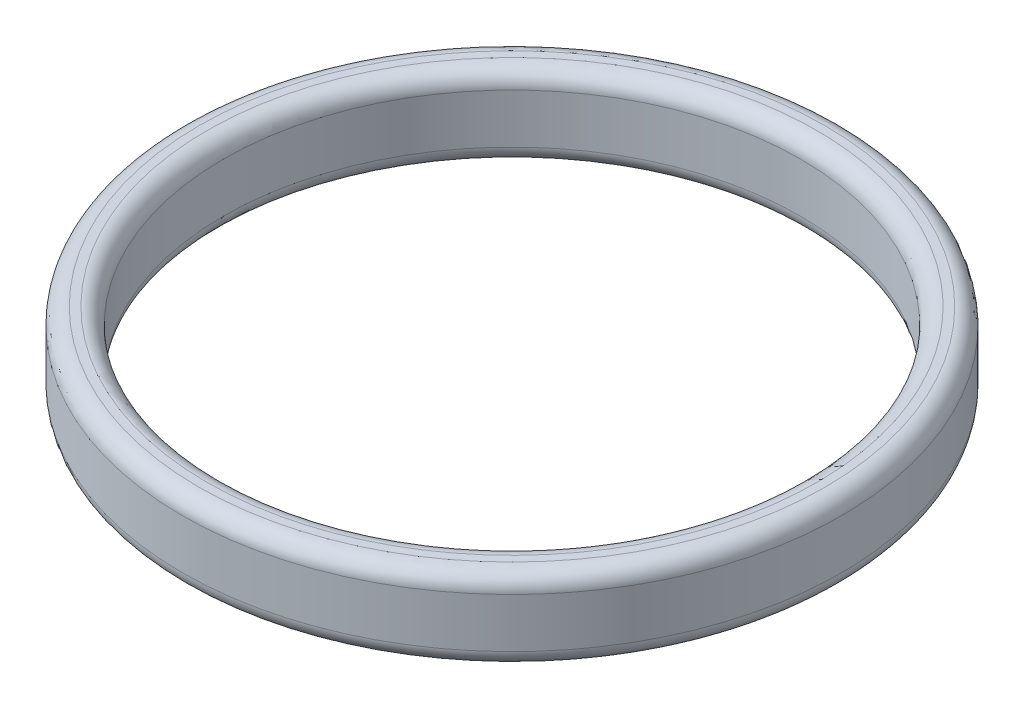
ISO-10303-21;
HEADER;
FILE_DESCRIPTION(('STEP AP214'),'2;1');
FILE_NAME('part.step','',(''),(''),'','','');
FILE_SCHEMA(('AUTOMOTIVE_DESIGN { 1 0 10303 214 1 1 1 1 }'));
ENDSEC;
DATA;
#1=APPLICATION_CONTEXT('core data for automotive mechanical design processes');
#2=APPLICATION_PROTOCOL_DEFINITION('international standard','automotive_design',2000,#1);
#3=PRODUCT_CONTEXT('',#1,'mechanical');
#4=PRODUCT('Part','Part','',(#3));
#5=PRODUCT_RELATED_PRODUCT_CATEGORY('part','',(#4));
#6=PRODUCT_DEFINITION_FORMATION('','',#4);
#7=PRODUCT_DEFINITION_CONTEXT('part definition',#1,'design');
#8=PRODUCT_DEFINITION('design','',#6,#7);
#9=PRODUCT_DEFINITION_SHAPE('','',#8);
#10=(LENGTH_UNIT() NAMED_UNIT(*) SI_UNIT(.MILLI.,.METRE.));
#11=(NAMED_UNIT(*) PLANE_ANGLE_UNIT() SI_UNIT($,.RADIAN.));
#12=(NAMED_UNIT(*) SI_UNIT($,.STERADIAN.) SOLID_ANGLE_UNIT());
#13=UNCERTAINTY_MEASURE_WITH_UNIT(LENGTH_MEASURE(1.E-05),#10,'distance_accuracy_value','');
#14=(GEOMETRIC_REPRESENTATION_CONTEXT(3) GLOBAL_UNCERTAINTY_ASSIGNED_CONTEXT((#13)) GLOBAL_UNIT_ASSIGNED_CONTEXT((#10,
#11,#12)) REPRESENTATION_CONTEXT('',''));
#15=CARTESIAN_POINT('',(0.,0.,0.));
#16=DIRECTION('',(0.,0.,1.));
#17=DIRECTION('',(1.,0.,0.));
#18=AXIS2_PLACEMENT_3D('',#15,#16,#17);
#19=CARTESIAN_POINT('',(0.,0.,0.));
#20=DIRECTION('',(0.,1.,0.));
#21=DIRECTION('',(1.,0.,0.));
#22=AXIS2_PLACEMENT_3D('',#19,#20,#21);
#23=PLANE('',#22);
#24=CARTESIAN_POINT('',(0.,0.,0.));
#25=DIRECTION('',(0.,1.,0.));
#26=DIRECTION('',(0.,0.,1.));
#27=AXIS2_PLACEMENT_3D('',#24,#25,#26);
#28=CIRCLE('',#27,5.0875);
#29=CARTESIAN_POINT('',(0.,0.,5.0875));
#30=VERTEX_POINT('',#29);
#31=EDGE_CURVE('E44',#30,#30,#28,.T.);
#32=ORIENTED_EDGE('',*,*,#31,.T.);
#33=EDGE_LOOP('',(#32));
#34=FACE_BOUND('',#33,.T.);
#35=CARTESIAN_POINT('',(0.,0.,0.));
#36=DIRECTION('',(0.,-1.,0.));
#37=DIRECTION('',(0.,0.,1.));
#38=AXIS2_PLACEMENT_3D('',#35,#36,#37);
#39=CIRCLE('',#38,5.225);
#40=CARTESIAN_POINT('',(0.,0.,5.225));
#41=VERTEX_POINT('',#40);
#42=EDGE_CURVE('E53',#41,#41,#39,.T.);
#43=ORIENTED_EDGE('',*,*,#42,.T.);
#44=EDGE_LOOP('',(#43));
#45=FACE_BOUND('',#44,.T.);
#46=ADVANCED_FACE('F15',(#34,#45),#23,.F.);
#47=CARTESIAN_POINT('',(0.,1.375,0.));
#48=DIRECTION('',(0.,1.,0.));
#49=DIRECTION('',(1.,0.,0.));
#50=AXIS2_PLACEMENT_3D('',#47,#48,#49);
#51=PLANE('',#50);
#52=CARTESIAN_POINT('',(0.,1.375,0.));
#53=DIRECTION('',(0.,-1.,0.));
#54=DIRECTION('',(0.,0.,1.));
#55=AXIS2_PLACEMENT_3D('',#52,#53,#54);
#56=CIRCLE('',#55,5.0875);
#57=CARTESIAN_POINT('',(0.,1.375,5.0875));
#58=VERTEX_POINT('',#57);
#59=EDGE_CURVE('E22',#58,#58,#56,.T.);
#60=ORIENTED_EDGE('',*,*,#59,.T.);
#61=EDGE_LOOP('',(#60));
#62=FACE_BOUND('',#61,.T.);
#63=CARTESIAN_POINT('',(0.,1.375,0.));
#64=DIRECTION('',(0.,1.,0.));
#65=DIRECTION('',(0.,0.,1.));
#66=AXIS2_PLACEMENT_3D('',#63,#64,#65);
#67=CIRCLE('',#66,5.225);
#68=CARTESIAN_POINT('',(0.,1.375,5.225));
#69=VERTEX_POINT('',#68);
#70=EDGE_CURVE('E31',#69,#69,#67,.T.);
#71=ORIENTED_EDGE('',*,*,#70,.T.);
#72=EDGE_LOOP('',(#71));
#73=FACE_BOUND('',#72,.T.);
#74=ADVANCED_FACE('F85',(#62,#73),#51,.T.);
#75=CARTESIAN_POINT('',(0.,1.375,0.));
#76=DIRECTION('',(0.,-1.,0.));
#77=DIRECTION('',(0.,0.,-1.));
#78=AXIS2_PLACEMENT_3D('',#75,#76,#77);
#79=CYLINDRICAL_SURFACE('',#78,5.5);
#80=CARTESIAN_POINT('',(0.,0.275,0.));
#81=DIRECTION('',(0.,1.,0.));
#82=DIRECTION('',(0.,0.,1.));
#83=AXIS2_PLACEMENT_3D('',#80,#81,#82);
#84=CIRCLE('',#83,5.5);
#85=CARTESIAN_POINT('',(0.,0.275,5.5));
#86=VERTEX_POINT('',#85);
#87=EDGE_CURVE('E48',#86,#86,#84,.T.);
#88=ORIENTED_EDGE('',*,*,#87,.T.);
#89=EDGE_LOOP('',(#88));
#90=FACE_BOUND('',#89,.T.);
#91=CARTESIAN_POINT('',(0.,1.1,0.));
#92=DIRECTION('',(0.,-1.,0.));
#93=DIRECTION('',(0.,0.,1.));
#94=AXIS2_PLACEMENT_3D('',#91,#92,#93);
#95=CIRCLE('',#94,5.5);
#96=CARTESIAN_POINT('',(0.,1.1,5.5));
#97=VERTEX_POINT('',#96);
#98=EDGE_CURVE('E38',#97,#97,#95,.T.);
#99=ORIENTED_EDGE('',*,*,#98,.T.);
#100=EDGE_LOOP('',(#99));
#101=FACE_BOUND('',#100,.T.);
#102=ADVANCED_FACE('F76',(#90,#101),#79,.T.);
#103=CARTESIAN_POINT('',(0.,1.375,0.));
#104=DIRECTION('',(0.,-1.,0.));
#105=DIRECTION('',(0.,0.,-1.));
#106=AXIS2_PLACEMENT_3D('',#103,#104,#105);
#107=CYLINDRICAL_SURFACE('',#106,4.8125);
#108=CARTESIAN_POINT('',(0.,0.275,0.));
#109=DIRECTION('',(0.,-1.,0.));
#110=DIRECTION('',(0.,0.,1.));
#111=AXIS2_PLACEMENT_3D('',#108,#109,#110);
#112=CIRCLE('',#111,4.8125);
#113=CARTESIAN_POINT('',(0.,0.275,4.8125));
#114=VERTEX_POINT('',#113);
#115=EDGE_CURVE('E45',#114,#114,#112,.T.);
#116=ORIENTED_EDGE('',*,*,#115,.T.);
#117=EDGE_LOOP('',(#116));
#118=FACE_BOUND('',#117,.T.);
#119=CARTESIAN_POINT('',(0.,1.1,0.));
#120=DIRECTION('',(0.,1.,0.));
#121=DIRECTION('',(0.,0.,1.));
#122=AXIS2_PLACEMENT_3D('',#119,#120,#121);
#123=CIRCLE('',#122,4.8125);
#124=CARTESIAN_POINT('',(0.,1.1,4.8125));
#125=VERTEX_POINT('',#124);
#126=EDGE_CURVE('E10',#125,#125,#123,.T.);
#127=ORIENTED_EDGE('',*,*,#126,.T.);
#128=EDGE_LOOP('',(#127));
#129=FACE_BOUND('',#128,.T.);
#130=ADVANCED_FACE('F73',(#118,#129),#107,.F.);
#131=CARTESIAN_POINT('',(0.,1.1,0.));
#132=DIRECTION('',(0.,1.,0.));
#133=DIRECTION('',(0.,0.,1.));
#134=AXIS2_PLACEMENT_3D('',#131,#132,#133);
#135=TOROIDAL_SURFACE('',#134,5.0875,0.275);
#136=ORIENTED_EDGE('',*,*,#126,.F.);
#137=EDGE_LOOP('',(#136));
#138=FACE_BOUND('',#137,.T.);
#139=ORIENTED_EDGE('',*,*,#59,.F.);
#140=EDGE_LOOP('',(#139));
#141=FACE_BOUND('',#140,.T.);
#142=ADVANCED_FACE('F75',(#138,#141),#135,.T.);
#143=CARTESIAN_POINT('',(0.,1.1,0.));
#144=DIRECTION('',(0.,1.,0.));
#145=DIRECTION('',(0.,0.,1.));
#146=AXIS2_PLACEMENT_3D('',#143,#144,#145);
#147=TOROIDAL_SURFACE('',#146,5.225,0.275);
#148=ORIENTED_EDGE('',*,*,#70,.F.);
#149=EDGE_LOOP('',(#148));
#150=FACE_BOUND('',#149,.T.);
#151=ORIENTED_EDGE('',*,*,#98,.F.);
#152=EDGE_LOOP('',(#151));
#153=FACE_BOUND('',#152,.T.);
#154=ADVANCED_FACE('F69',(#150,#153),#147,.T.);
#155=CARTESIAN_POINT('',(0.,0.275,0.));
#156=DIRECTION('',(0.,1.,0.));
#157=DIRECTION('',(0.,0.,1.));
#158=AXIS2_PLACEMENT_3D('',#155,#156,#157);
#159=TOROIDAL_SURFACE('',#158,5.0875,0.275);
#160=ORIENTED_EDGE('',*,*,#31,.F.);
#161=EDGE_LOOP('',(#160));
#162=FACE_BOUND('',#161,.T.);
#163=ORIENTED_EDGE('',*,*,#115,.F.);
#164=EDGE_LOOP('',(#163));
#165=FACE_BOUND('',#164,.T.);
#166=ADVANCED_FACE('F65',(#162,#165),#159,.T.);
#167=CARTESIAN_POINT('',(0.,0.275,0.));
#168=DIRECTION('',(0.,1.,0.));
#169=DIRECTION('',(0.,0.,1.));
#170=AXIS2_PLACEMENT_3D('',#167,#168,#169);
#171=TOROIDAL_SURFACE('',#170,5.225,0.275);
#172=ORIENTED_EDGE('',*,*,#87,.F.);
#173=EDGE_LOOP('',(#172));
#174=FACE_BOUND('',#173,.T.);
#175=ORIENTED_EDGE('',*,*,#42,.F.);
#176=EDGE_LOOP('',(#175));
#177=FACE_BOUND('',#176,.T.);
#178=ADVANCED_FACE('F68',(#174,#177),#171,.T.);
#179=CLOSED_SHELL('',(#46,#74,#102,#130,#142,#154,#166,#178));
#180=MANIFOLD_SOLID_BREP('B1',#179);
#181=ADVANCED_BREP_SHAPE_REPRESENTATION('',(#18,#180),#14);
#182=SHAPE_DEFINITION_REPRESENTATION(#9,#181);
ENDSEC;
END-ISO-10303-21;
